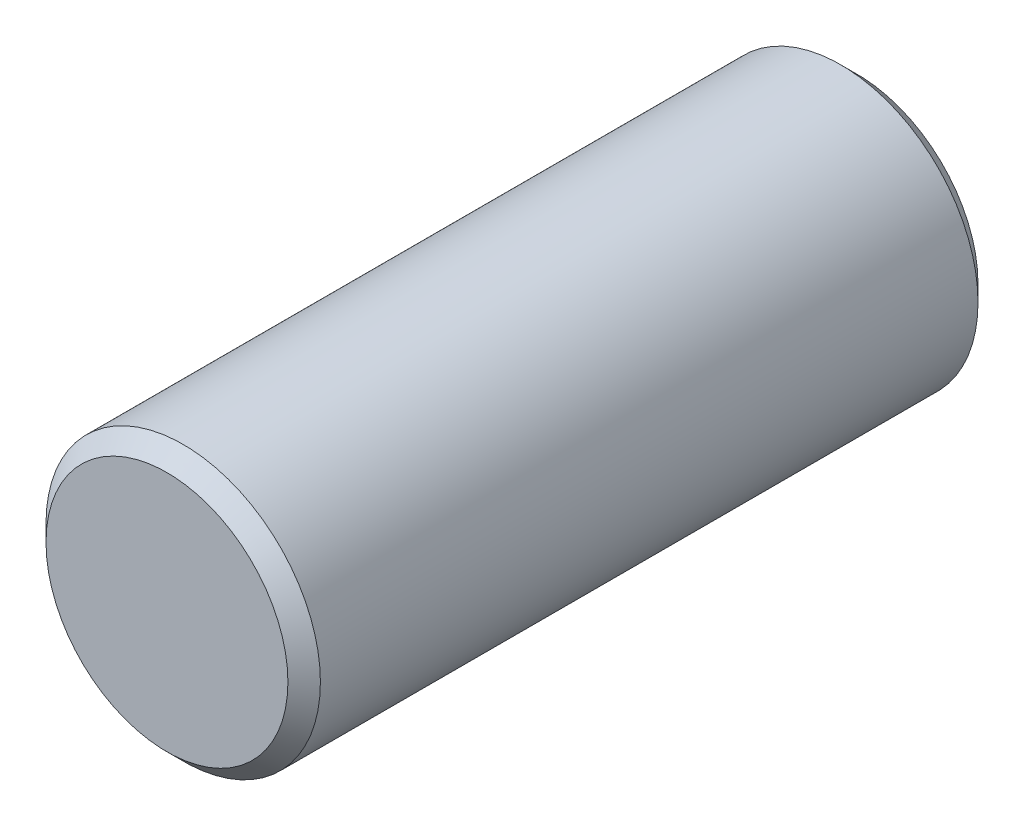
ISO-10303-21;
HEADER;
FILE_DESCRIPTION(('STEP AP214'),'2;1');
FILE_NAME('part.step','',(''),(''),'','','');
FILE_SCHEMA(('AUTOMOTIVE_DESIGN { 1 0 10303 214 1 1 1 1 }'));
ENDSEC;
DATA;
#1=APPLICATION_CONTEXT('core data for automotive mechanical design processes');
#2=APPLICATION_PROTOCOL_DEFINITION('international standard','automotive_design',2000,#1);
#3=PRODUCT_CONTEXT('',#1,'mechanical');
#4=PRODUCT('Part','Part','',(#3));
#5=PRODUCT_RELATED_PRODUCT_CATEGORY('part','',(#4));
#6=PRODUCT_DEFINITION_FORMATION('','',#4);
#7=PRODUCT_DEFINITION_CONTEXT('part definition',#1,'design');
#8=PRODUCT_DEFINITION('design','',#6,#7);
#9=PRODUCT_DEFINITION_SHAPE('','',#8);
#10=(LENGTH_UNIT() NAMED_UNIT(*) SI_UNIT(.MILLI.,.METRE.));
#11=(NAMED_UNIT(*) PLANE_ANGLE_UNIT() SI_UNIT($,.RADIAN.));
#12=(NAMED_UNIT(*) SI_UNIT($,.STERADIAN.) SOLID_ANGLE_UNIT());
#13=UNCERTAINTY_MEASURE_WITH_UNIT(LENGTH_MEASURE(1.E-05),#10,'distance_accuracy_value','');
#14=(GEOMETRIC_REPRESENTATION_CONTEXT(3) GLOBAL_UNCERTAINTY_ASSIGNED_CONTEXT((#13)) GLOBAL_UNIT_ASSIGNED_CONTEXT((#10,
#11,#12)) REPRESENTATION_CONTEXT('',''));
#15=CARTESIAN_POINT('',(0.,0.,0.));
#16=DIRECTION('',(0.,0.,1.));
#17=DIRECTION('',(1.,0.,0.));
#18=AXIS2_PLACEMENT_3D('',#15,#16,#17);
#19=CARTESIAN_POINT('',(0.,0.,42.5));
#20=DIRECTION('',(0.,0.,-1.));
#21=DIRECTION('',(-1.,0.,0.));
#22=AXIS2_PLACEMENT_3D('',#19,#20,#21);
#23=CYLINDRICAL_SURFACE('',#22,16.9);
#24=CARTESIAN_POINT('',(0.,0.,-40.5));
#25=DIRECTION('',(0.,0.,1.));
#26=DIRECTION('',(1.,0.,0.));
#27=AXIS2_PLACEMENT_3D('',#24,#25,#26);
#28=CIRCLE('',#27,16.9);
#29=CARTESIAN_POINT('',(16.9,0.,-40.5));
#30=VERTEX_POINT('',#29);
#31=EDGE_CURVE('E45',#30,#30,#28,.T.);
#32=ORIENTED_EDGE('',*,*,#31,.T.);
#33=EDGE_LOOP('',(#32));
#34=FACE_BOUND('',#33,.T.);
#35=CARTESIAN_POINT('',(0.,0.,40.5));
#36=DIRECTION('',(0.,0.,1.));
#37=DIRECTION('',(1.,0.,0.));
#38=AXIS2_PLACEMENT_3D('',#35,#36,#37);
#39=CIRCLE('',#38,16.9);
#40=CARTESIAN_POINT('',(16.9,0.,40.5));
#41=VERTEX_POINT('',#40);
#42=EDGE_CURVE('E49',#41,#41,#39,.F.);
#43=ORIENTED_EDGE('',*,*,#42,.T.);
#44=EDGE_LOOP('',(#43));
#45=FACE_BOUND('',#44,.T.);
#46=ADVANCED_FACE('F37',(#34,#45),#23,.T.);
#47=CARTESIAN_POINT('',(0.,0.,42.5));
#48=DIRECTION('',(0.,0.,1.));
#49=DIRECTION('',(1.,0.,0.));
#50=AXIS2_PLACEMENT_3D('',#47,#48,#49);
#51=PLANE('',#50);
#52=CARTESIAN_POINT('',(0.,0.,42.5));
#53=DIRECTION('',(0.,0.,1.));
#54=DIRECTION('',(1.,0.,0.));
#55=AXIS2_PLACEMENT_3D('',#52,#53,#54);
#56=CIRCLE('',#55,14.9);
#57=CARTESIAN_POINT('',(14.9,0.,42.5));
#58=VERTEX_POINT('',#57);
#59=EDGE_CURVE('E53',#58,#58,#56,.T.);
#60=ORIENTED_EDGE('',*,*,#59,.T.);
#61=EDGE_LOOP('',(#60));
#62=FACE_BOUND('',#61,.T.);
#63=ADVANCED_FACE('F59',(#62),#51,.T.);
#64=CARTESIAN_POINT('',(0.,0.,-42.5));
#65=DIRECTION('',(0.,0.,1.));
#66=DIRECTION('',(1.,0.,0.));
#67=AXIS2_PLACEMENT_3D('',#64,#65,#66);
#68=PLANE('',#67);
#69=CARTESIAN_POINT('',(0.,0.,-42.5));
#70=DIRECTION('',(0.,0.,1.));
#71=DIRECTION('',(1.,0.,0.));
#72=AXIS2_PLACEMENT_3D('',#69,#70,#71);
#73=CIRCLE('',#72,14.9);
#74=CARTESIAN_POINT('',(14.9,0.,-42.5));
#75=VERTEX_POINT('',#74);
#76=EDGE_CURVE('E10',#75,#75,#73,.F.);
#77=ORIENTED_EDGE('',*,*,#76,.T.);
#78=EDGE_LOOP('',(#77));
#79=FACE_BOUND('',#78,.T.);
#80=ADVANCED_FACE('F63',(#79),#68,.F.);
#81=CARTESIAN_POINT('',(0.,0.,42.5));
#82=DIRECTION('',(0.,0.,-1.));
#83=DIRECTION('',(-1.,0.,0.));
#84=AXIS2_PLACEMENT_3D('',#81,#82,#83);
#85=CONICAL_SURFACE('',#84,14.9,0.785398163397443);
#86=ORIENTED_EDGE('',*,*,#42,.F.);
#87=EDGE_LOOP('',(#86));
#88=FACE_BOUND('',#87,.T.);
#89=ORIENTED_EDGE('',*,*,#59,.F.);
#90=EDGE_LOOP('',(#89));
#91=FACE_BOUND('',#90,.T.);
#92=ADVANCED_FACE('F61',(#88,#91),#85,.T.);
#93=CARTESIAN_POINT('',(0.,0.,-40.5));
#94=DIRECTION('',(0.,0.,1.));
#95=DIRECTION('',(1.,0.,0.));
#96=AXIS2_PLACEMENT_3D('',#93,#94,#95);
#97=CONICAL_SURFACE('',#96,16.9,0.78539816339745);
#98=ORIENTED_EDGE('',*,*,#76,.F.);
#99=EDGE_LOOP('',(#98));
#100=FACE_BOUND('',#99,.T.);
#101=ORIENTED_EDGE('',*,*,#31,.F.);
#102=EDGE_LOOP('',(#101));
#103=FACE_BOUND('',#102,.T.);
#104=ADVANCED_FACE('F40',(#100,#103),#97,.T.);
#105=CLOSED_SHELL('',(#46,#63,#80,#92,#104));
#106=MANIFOLD_SOLID_BREP('B2',#105);
#107=ADVANCED_BREP_SHAPE_REPRESENTATION('',(#18,#106),#14);
#108=SHAPE_DEFINITION_REPRESENTATION(#9,#107);
ENDSEC;
END-ISO-10303-21;
